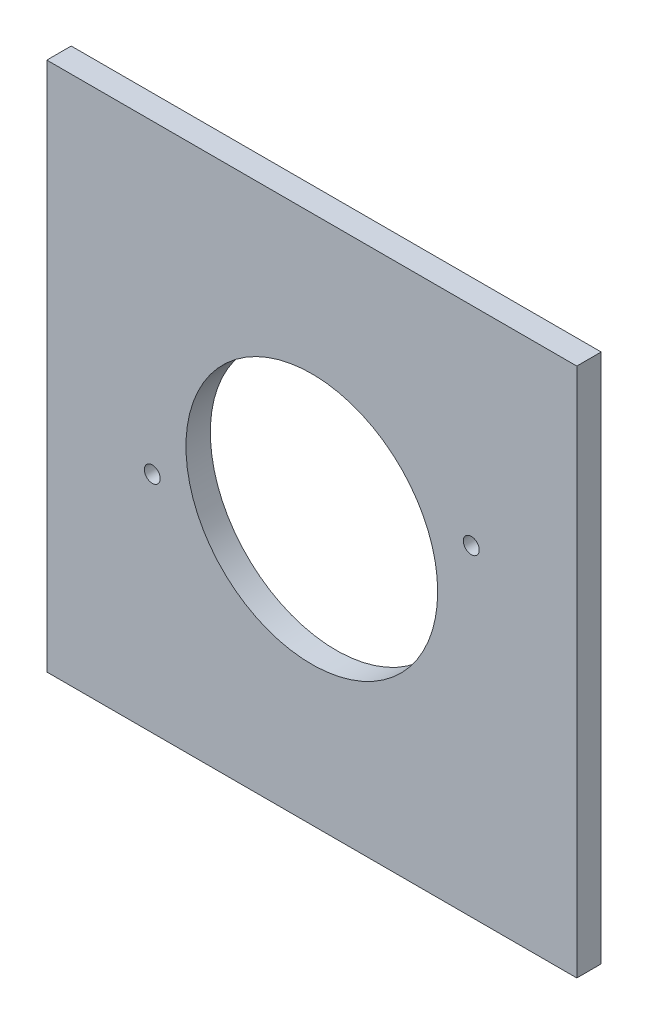
ISO-10303-21;
HEADER;
FILE_DESCRIPTION(('STEP AP214'),'2;1');
FILE_NAME('part.step','',(''),(''),'','','');
FILE_SCHEMA(('AUTOMOTIVE_DESIGN { 1 0 10303 214 1 1 1 1 }'));
ENDSEC;
DATA;
#1=APPLICATION_CONTEXT('core data for automotive mechanical design processes');
#2=APPLICATION_PROTOCOL_DEFINITION('international standard','automotive_design',2000,#1);
#3=PRODUCT_CONTEXT('',#1,'mechanical');
#4=PRODUCT('Part','Part','',(#3));
#5=PRODUCT_RELATED_PRODUCT_CATEGORY('part','',(#4));
#6=PRODUCT_DEFINITION_FORMATION('','',#4);
#7=PRODUCT_DEFINITION_CONTEXT('part definition',#1,'design');
#8=PRODUCT_DEFINITION('design','',#6,#7);
#9=PRODUCT_DEFINITION_SHAPE('','',#8);
#10=(LENGTH_UNIT() NAMED_UNIT(*) SI_UNIT(.MILLI.,.METRE.));
#11=(NAMED_UNIT(*) PLANE_ANGLE_UNIT() SI_UNIT($,.RADIAN.));
#12=(NAMED_UNIT(*) SI_UNIT($,.STERADIAN.) SOLID_ANGLE_UNIT());
#13=UNCERTAINTY_MEASURE_WITH_UNIT(LENGTH_MEASURE(1.E-05),#10,'distance_accuracy_value','');
#14=(GEOMETRIC_REPRESENTATION_CONTEXT(3) GLOBAL_UNCERTAINTY_ASSIGNED_CONTEXT((#13)) GLOBAL_UNIT_ASSIGNED_CONTEXT((#10,
#11,#12)) REPRESENTATION_CONTEXT('',''));
#15=CARTESIAN_POINT('',(0.,0.,0.));
#16=DIRECTION('',(0.,0.,1.));
#17=DIRECTION('',(1.,0.,0.));
#18=AXIS2_PLACEMENT_3D('',#15,#16,#17);
#19=CARTESIAN_POINT('',(-24.2716804571744,-21.5598841251449,-5.4));
#20=DIRECTION('',(0.,0.,1.));
#21=DIRECTION('',(1.,0.,0.));
#22=AXIS2_PLACEMENT_3D('',#19,#20,#21);
#23=CYLINDRICAL_SURFACE('',#22,1.5);
#24=CARTESIAN_POINT('',(-24.2716804571744,-21.5598841251449,4.6));
#25=DIRECTION('',(0.,0.,1.));
#26=DIRECTION('',(1.,0.,0.));
#27=AXIS2_PLACEMENT_3D('',#24,#25,#26);
#28=CIRCLE('',#27,1.5);
#29=CARTESIAN_POINT('',(-22.7716804571744,-21.5598841251449,4.6));
#30=VERTEX_POINT('',#29);
#31=EDGE_CURVE('E110',#30,#30,#28,.T.);
#32=ORIENTED_EDGE('',*,*,#31,.T.);
#33=EDGE_LOOP('',(#32));
#34=FACE_BOUND('',#33,.T.);
#35=CARTESIAN_POINT('',(-24.2716804571744,-21.5598841251449,2.));
#36=DIRECTION('',(0.,0.,-1.));
#37=DIRECTION('',(-1.,0.,0.));
#38=AXIS2_PLACEMENT_3D('',#35,#36,#37);
#39=CIRCLE('',#38,1.5);
#40=CARTESIAN_POINT('',(-25.7716804571744,-21.5598841251449,2.));
#41=VERTEX_POINT('',#40);
#42=EDGE_CURVE('E41',#41,#41,#39,.F.);
#43=ORIENTED_EDGE('',*,*,#42,.F.);
#44=EDGE_LOOP('',(#43));
#45=FACE_BOUND('',#44,.T.);
#46=ADVANCED_FACE('F37',(#34,#45),#23,.F.);
#47=CARTESIAN_POINT('',(35.9183195428256,-3.12988412514487,-5.4));
#48=DIRECTION('',(0.,0.,1.));
#49=DIRECTION('',(1.,0.,0.));
#50=AXIS2_PLACEMENT_3D('',#47,#48,#49);
#51=CYLINDRICAL_SURFACE('',#50,1.5);
#52=CARTESIAN_POINT('',(35.9183195428256,-3.12988412514487,4.6));
#53=DIRECTION('',(0.,0.,1.));
#54=DIRECTION('',(1.,0.,0.));
#55=AXIS2_PLACEMENT_3D('',#52,#53,#54);
#56=CIRCLE('',#55,1.5);
#57=CARTESIAN_POINT('',(37.4183195428256,-3.12988412514487,4.6));
#58=VERTEX_POINT('',#57);
#59=EDGE_CURVE('E121',#58,#58,#56,.T.);
#60=ORIENTED_EDGE('',*,*,#59,.T.);
#61=EDGE_LOOP('',(#60));
#62=FACE_BOUND('',#61,.T.);
#63=CARTESIAN_POINT('',(35.9183195428256,-3.12988412514487,2.));
#64=DIRECTION('',(0.,0.,-1.));
#65=DIRECTION('',(-1.,0.,0.));
#66=AXIS2_PLACEMENT_3D('',#63,#64,#65);
#67=CIRCLE('',#66,1.5);
#68=CARTESIAN_POINT('',(34.4183195428256,-3.12988412514487,2.));
#69=VERTEX_POINT('',#68);
#70=EDGE_CURVE('E119',#69,#69,#67,.F.);
#71=ORIENTED_EDGE('',*,*,#70,.F.);
#72=EDGE_LOOP('',(#71));
#73=FACE_BOUND('',#72,.T.);
#74=ADVANCED_FACE('F161',(#62,#73),#51,.F.);
#75=CARTESIAN_POINT('',(0.,-63.8498841251449,4.6));
#76=DIRECTION('',(0.,1.,0.));
#77=DIRECTION('',(-1.,0.,0.));
#78=AXIS2_PLACEMENT_3D('',#75,#76,#77);
#79=PLANE('',#78);
#80=DIRECTION('',(1.,0.,0.));
#81=VECTOR('',#80,1.);
#82=CARTESIAN_POINT('',(0.,-63.8498841251449,0.));
#83=LINE('',#82,#81);
#84=CARTESIAN_POINT('',(-44.1716804571744,-63.8498841251449,0.));
#85=VERTEX_POINT('',#84);
#86=CARTESIAN_POINT('',(55.8283195428256,-63.8498841251448,0.));
#87=VERTEX_POINT('',#86);
#88=EDGE_CURVE('E107',#85,#87,#83,.T.);
#89=ORIENTED_EDGE('',*,*,#88,.T.);
#90=DIRECTION('',(0.,0.,-1.));
#91=VECTOR('',#90,1.);
#92=CARTESIAN_POINT('',(55.8283195428256,-63.8498841251448,4.6));
#93=LINE('',#92,#91);
#94=CARTESIAN_POINT('',(55.8283195428256,-63.8498841251448,4.6));
#95=VERTEX_POINT('',#94);
#96=EDGE_CURVE('E11',#95,#87,#93,.T.);
#97=ORIENTED_EDGE('',*,*,#96,.F.);
#98=DIRECTION('',(1.,0.,0.));
#99=VECTOR('',#98,1.);
#100=CARTESIAN_POINT('',(0.,-63.8498841251449,4.6));
#101=LINE('',#100,#99);
#102=CARTESIAN_POINT('',(-44.1716804571744,-63.8498841251449,4.6));
#103=VERTEX_POINT('',#102);
#104=EDGE_CURVE('E79',#103,#95,#101,.T.);
#105=ORIENTED_EDGE('',*,*,#104,.F.);
#106=DIRECTION('',(0.,0.,-1.));
#107=VECTOR('',#106,1.);
#108=CARTESIAN_POINT('',(-44.1716804571744,-63.8498841251449,4.6));
#109=LINE('',#108,#107);
#110=EDGE_CURVE('E106',#103,#85,#109,.T.);
#111=ORIENTED_EDGE('',*,*,#110,.T.);
#112=EDGE_LOOP('',(#89,#97,#105,#111));
#113=FACE_BOUND('',#112,.T.);
#114=ADVANCED_FACE('F39',(#113),#79,.F.);
#115=CARTESIAN_POINT('',(55.8283195428256,0.,4.6));
#116=DIRECTION('',(1.,0.,0.));
#117=DIRECTION('',(0.,1.,0.));
#118=AXIS2_PLACEMENT_3D('',#115,#116,#117);
#119=PLANE('',#118);
#120=DIRECTION('',(0.,-1.,0.));
#121=VECTOR('',#120,1.);
#122=CARTESIAN_POINT('',(55.8283195428256,0.,0.));
#123=LINE('',#122,#121);
#124=CARTESIAN_POINT('',(55.8283195428256,36.1501158748551,0.));
#125=VERTEX_POINT('',#124);
#126=EDGE_CURVE('E88',#125,#87,#123,.T.);
#127=ORIENTED_EDGE('',*,*,#126,.F.);
#128=DIRECTION('',(0.,0.,-1.));
#129=VECTOR('',#128,1.);
#130=CARTESIAN_POINT('',(55.8283195428256,36.1501158748551,4.6));
#131=LINE('',#130,#129);
#132=CARTESIAN_POINT('',(55.8283195428256,36.1501158748551,4.6));
#133=VERTEX_POINT('',#132);
#134=EDGE_CURVE('E47',#133,#125,#131,.T.);
#135=ORIENTED_EDGE('',*,*,#134,.F.);
#136=DIRECTION('',(0.,-1.,0.));
#137=VECTOR('',#136,1.);
#138=CARTESIAN_POINT('',(55.8283195428256,0.,4.6));
#139=LINE('',#138,#137);
#140=EDGE_CURVE('E86',#133,#95,#139,.T.);
#141=ORIENTED_EDGE('',*,*,#140,.T.);
#142=ORIENTED_EDGE('',*,*,#96,.T.);
#143=EDGE_LOOP('',(#127,#135,#141,#142));
#144=FACE_BOUND('',#143,.T.);
#145=ADVANCED_FACE('F85',(#144),#119,.T.);
#146=CARTESIAN_POINT('',(0.,36.1501158748551,4.6));
#147=DIRECTION('',(0.,1.,0.));
#148=DIRECTION('',(0.,0.,1.));
#149=AXIS2_PLACEMENT_3D('',#146,#147,#148);
#150=PLANE('',#149);
#151=DIRECTION('',(1.,0.,0.));
#152=VECTOR('',#151,1.);
#153=CARTESIAN_POINT('',(0.,36.1501158748551,0.));
#154=LINE('',#153,#152);
#155=CARTESIAN_POINT('',(-44.1716804571744,36.1501158748551,0.));
#156=VERTEX_POINT('',#155);
#157=EDGE_CURVE('E112',#156,#125,#154,.T.);
#158=ORIENTED_EDGE('',*,*,#157,.F.);
#159=DIRECTION('',(0.,0.,-1.));
#160=VECTOR('',#159,1.);
#161=CARTESIAN_POINT('',(-44.1716804571744,36.1501158748551,4.6));
#162=LINE('',#161,#160);
#163=CARTESIAN_POINT('',(-44.1716804571744,36.1501158748551,4.6));
#164=VERTEX_POINT('',#163);
#165=EDGE_CURVE('E71',#164,#156,#162,.T.);
#166=ORIENTED_EDGE('',*,*,#165,.F.);
#167=DIRECTION('',(1.,0.,0.));
#168=VECTOR('',#167,1.);
#169=CARTESIAN_POINT('',(0.,36.1501158748551,4.6));
#170=LINE('',#169,#168);
#171=EDGE_CURVE('E96',#164,#133,#170,.T.);
#172=ORIENTED_EDGE('',*,*,#171,.T.);
#173=ORIENTED_EDGE('',*,*,#134,.T.);
#174=EDGE_LOOP('',(#158,#166,#172,#173));
#175=FACE_BOUND('',#174,.T.);
#176=ADVANCED_FACE('F98',(#175),#150,.T.);
#177=CARTESIAN_POINT('',(-44.1716804571744,0.,4.6));
#178=DIRECTION('',(1.,0.,0.));
#179=DIRECTION('',(0.,1.,0.));
#180=AXIS2_PLACEMENT_3D('',#177,#178,#179);
#181=PLANE('',#180);
#182=DIRECTION('',(0.,-1.,0.));
#183=VECTOR('',#182,1.);
#184=CARTESIAN_POINT('',(-44.1716804571744,0.,0.));
#185=LINE('',#184,#183);
#186=EDGE_CURVE('E74',#156,#85,#185,.T.);
#187=ORIENTED_EDGE('',*,*,#186,.T.);
#188=ORIENTED_EDGE('',*,*,#110,.F.);
#189=DIRECTION('',(0.,-1.,0.));
#190=VECTOR('',#189,1.);
#191=CARTESIAN_POINT('',(-44.1716804571744,0.,4.6));
#192=LINE('',#191,#190);
#193=EDGE_CURVE('E56',#164,#103,#192,.T.);
#194=ORIENTED_EDGE('',*,*,#193,.F.);
#195=ORIENTED_EDGE('',*,*,#165,.T.);
#196=EDGE_LOOP('',(#187,#188,#194,#195));
#197=FACE_BOUND('',#196,.T.);
#198=ADVANCED_FACE('F155',(#197),#181,.F.);
#199=CARTESIAN_POINT('',(5.8283195428256,-13.8498841251449,4.6));
#200=DIRECTION('',(0.,0.,-1.));
#201=DIRECTION('',(-1.,0.,0.));
#202=AXIS2_PLACEMENT_3D('',#199,#200,#201);
#203=CYLINDRICAL_SURFACE('',#202,23.75);
#204=CARTESIAN_POINT('',(5.8283195428256,-13.8498841251449,4.6));
#205=DIRECTION('',(0.,0.,1.));
#206=DIRECTION('',(1.,0.,0.));
#207=AXIS2_PLACEMENT_3D('',#204,#205,#206);
#208=CIRCLE('',#207,23.75);
#209=CARTESIAN_POINT('',(29.5783195428256,-13.8498841251449,4.6));
#210=VERTEX_POINT('',#209);
#211=EDGE_CURVE('E100',#210,#210,#208,.T.);
#212=ORIENTED_EDGE('',*,*,#211,.T.);
#213=EDGE_LOOP('',(#212));
#214=FACE_BOUND('',#213,.T.);
#215=CARTESIAN_POINT('',(5.8283195428256,-13.8498841251449,0.));
#216=DIRECTION('',(0.,0.,1.));
#217=DIRECTION('',(1.,0.,0.));
#218=AXIS2_PLACEMENT_3D('',#215,#216,#217);
#219=CIRCLE('',#218,23.75);
#220=CARTESIAN_POINT('',(29.5783195428256,-13.8498841251449,0.));
#221=VERTEX_POINT('',#220);
#222=EDGE_CURVE('E115',#221,#221,#219,.T.);
#223=ORIENTED_EDGE('',*,*,#222,.F.);
#224=EDGE_LOOP('',(#223));
#225=FACE_BOUND('',#224,.T.);
#226=ADVANCED_FACE('F145',(#214,#225),#203,.F.);
#227=CARTESIAN_POINT('',(0.,0.,4.6));
#228=DIRECTION('',(0.,0.,1.));
#229=DIRECTION('',(1.,0.,0.));
#230=AXIS2_PLACEMENT_3D('',#227,#228,#229);
#231=PLANE('',#230);
#232=ORIENTED_EDGE('',*,*,#59,.F.);
#233=EDGE_LOOP('',(#232));
#234=FACE_BOUND('',#233,.T.);
#235=ORIENTED_EDGE('',*,*,#31,.F.);
#236=EDGE_LOOP('',(#235));
#237=FACE_BOUND('',#236,.T.);
#238=ORIENTED_EDGE('',*,*,#104,.T.);
#239=ORIENTED_EDGE('',*,*,#140,.F.);
#240=ORIENTED_EDGE('',*,*,#171,.F.);
#241=ORIENTED_EDGE('',*,*,#193,.T.);
#242=EDGE_LOOP('',(#238,#239,#240,#241));
#243=FACE_BOUND('',#242,.T.);
#244=ORIENTED_EDGE('',*,*,#211,.F.);
#245=EDGE_LOOP('',(#244));
#246=FACE_BOUND('',#245,.T.);
#247=ADVANCED_FACE('F94',(#234,#237,#243,#246),#231,.T.);
#248=CARTESIAN_POINT('',(0.,0.,0.));
#249=DIRECTION('',(0.,0.,1.));
#250=DIRECTION('',(1.,0.,0.));
#251=AXIS2_PLACEMENT_3D('',#248,#249,#250);
#252=PLANE('',#251);
#253=CARTESIAN_POINT('',(-24.2716804571744,-21.5598841251449,0.));
#254=DIRECTION('',(0.,0.,-1.));
#255=DIRECTION('',(-1.,0.,0.));
#256=AXIS2_PLACEMENT_3D('',#253,#254,#255);
#257=CIRCLE('',#256,3.);
#258=CARTESIAN_POINT('',(-27.2716804571744,-21.5598841251449,0.));
#259=VERTEX_POINT('',#258);
#260=EDGE_CURVE('E135',#259,#259,#257,.T.);
#261=ORIENTED_EDGE('',*,*,#260,.F.);
#262=EDGE_LOOP('',(#261));
#263=FACE_BOUND('',#262,.T.);
#264=CARTESIAN_POINT('',(35.9183195428256,-3.12988412514487,0.));
#265=DIRECTION('',(0.,0.,-1.));
#266=DIRECTION('',(-1.,0.,0.));
#267=AXIS2_PLACEMENT_3D('',#264,#265,#266);
#268=CIRCLE('',#267,3.);
#269=CARTESIAN_POINT('',(32.9183195428256,-3.12988412514487,0.));
#270=VERTEX_POINT('',#269);
#271=EDGE_CURVE('E128',#270,#270,#268,.T.);
#272=ORIENTED_EDGE('',*,*,#271,.F.);
#273=EDGE_LOOP('',(#272));
#274=FACE_BOUND('',#273,.T.);
#275=ORIENTED_EDGE('',*,*,#88,.F.);
#276=ORIENTED_EDGE('',*,*,#186,.F.);
#277=ORIENTED_EDGE('',*,*,#157,.T.);
#278=ORIENTED_EDGE('',*,*,#126,.T.);
#279=EDGE_LOOP('',(#275,#276,#277,#278));
#280=FACE_BOUND('',#279,.T.);
#281=ORIENTED_EDGE('',*,*,#222,.T.);
#282=EDGE_LOOP('',(#281));
#283=FACE_BOUND('',#282,.T.);
#284=ADVANCED_FACE('F144',(#263,#274,#280,#283),#252,.F.);
#285=CARTESIAN_POINT('',(35.9183195428256,-3.12988412514487,2.));
#286=DIRECTION('',(0.,0.,-1.));
#287=DIRECTION('',(-1.,0.,0.));
#288=AXIS2_PLACEMENT_3D('',#285,#286,#287);
#289=PLANE('',#288);
#290=CARTESIAN_POINT('',(35.9183195428256,-3.12988412514487,2.));
#291=DIRECTION('',(0.,0.,-1.));
#292=DIRECTION('',(-1.,0.,0.));
#293=AXIS2_PLACEMENT_3D('',#290,#291,#292);
#294=CIRCLE('',#293,3.);
#295=CARTESIAN_POINT('',(32.9183195428256,-3.12988412514487,2.));
#296=VERTEX_POINT('',#295);
#297=EDGE_CURVE('E122',#296,#296,#294,.T.);
#298=ORIENTED_EDGE('',*,*,#297,.T.);
#299=EDGE_LOOP('',(#298));
#300=FACE_BOUND('',#299,.T.);
#301=ORIENTED_EDGE('',*,*,#70,.T.);
#302=EDGE_LOOP('',(#301));
#303=FACE_BOUND('',#302,.T.);
#304=ADVANCED_FACE('F152',(#300,#303),#289,.T.);
#305=CARTESIAN_POINT('',(35.9183195428256,-3.12988412514487,2.));
#306=DIRECTION('',(0.,0.,-1.));
#307=DIRECTION('',(-1.,0.,0.));
#308=AXIS2_PLACEMENT_3D('',#305,#306,#307);
#309=CYLINDRICAL_SURFACE('',#308,3.);
#310=ORIENTED_EDGE('',*,*,#297,.F.);
#311=EDGE_LOOP('',(#310));
#312=FACE_BOUND('',#311,.T.);
#313=ORIENTED_EDGE('',*,*,#271,.T.);
#314=EDGE_LOOP('',(#313));
#315=FACE_BOUND('',#314,.T.);
#316=ADVANCED_FACE('F168',(#312,#315),#309,.F.);
#317=CARTESIAN_POINT('',(-24.2716804571744,-21.5598841251449,2.));
#318=DIRECTION('',(0.,0.,-1.));
#319=DIRECTION('',(-1.,0.,0.));
#320=AXIS2_PLACEMENT_3D('',#317,#318,#319);
#321=PLANE('',#320);
#322=CARTESIAN_POINT('',(-24.2716804571744,-21.5598841251449,2.));
#323=DIRECTION('',(0.,0.,-1.));
#324=DIRECTION('',(-1.,0.,0.));
#325=AXIS2_PLACEMENT_3D('',#322,#323,#324);
#326=CIRCLE('',#325,3.);
#327=CARTESIAN_POINT('',(-27.2716804571744,-21.5598841251449,2.));
#328=VERTEX_POINT('',#327);
#329=EDGE_CURVE('E186',#328,#328,#326,.T.);
#330=ORIENTED_EDGE('',*,*,#329,.T.);
#331=EDGE_LOOP('',(#330));
#332=FACE_BOUND('',#331,.T.);
#333=ORIENTED_EDGE('',*,*,#42,.T.);
#334=EDGE_LOOP('',(#333));
#335=FACE_BOUND('',#334,.T.);
#336=ADVANCED_FACE('F171',(#332,#335),#321,.T.);
#337=CARTESIAN_POINT('',(-24.2716804571744,-21.5598841251449,2.));
#338=DIRECTION('',(0.,0.,-1.));
#339=DIRECTION('',(-1.,0.,0.));
#340=AXIS2_PLACEMENT_3D('',#337,#338,#339);
#341=CYLINDRICAL_SURFACE('',#340,3.);
#342=ORIENTED_EDGE('',*,*,#329,.F.);
#343=EDGE_LOOP('',(#342));
#344=FACE_BOUND('',#343,.T.);
#345=ORIENTED_EDGE('',*,*,#260,.T.);
#346=EDGE_LOOP('',(#345));
#347=FACE_BOUND('',#346,.T.);
#348=ADVANCED_FACE('F175',(#344,#347),#341,.F.);
#349=CLOSED_SHELL('',(#46,#74,#114,#145,#176,#198,#226,#247,#284,#304,#316,#336,#348));
#350=MANIFOLD_SOLID_BREP('B2',#349);
#351=ADVANCED_BREP_SHAPE_REPRESENTATION('',(#18,#350),#14);
#352=SHAPE_DEFINITION_REPRESENTATION(#9,#351);
ENDSEC;
END-ISO-10303-21;
